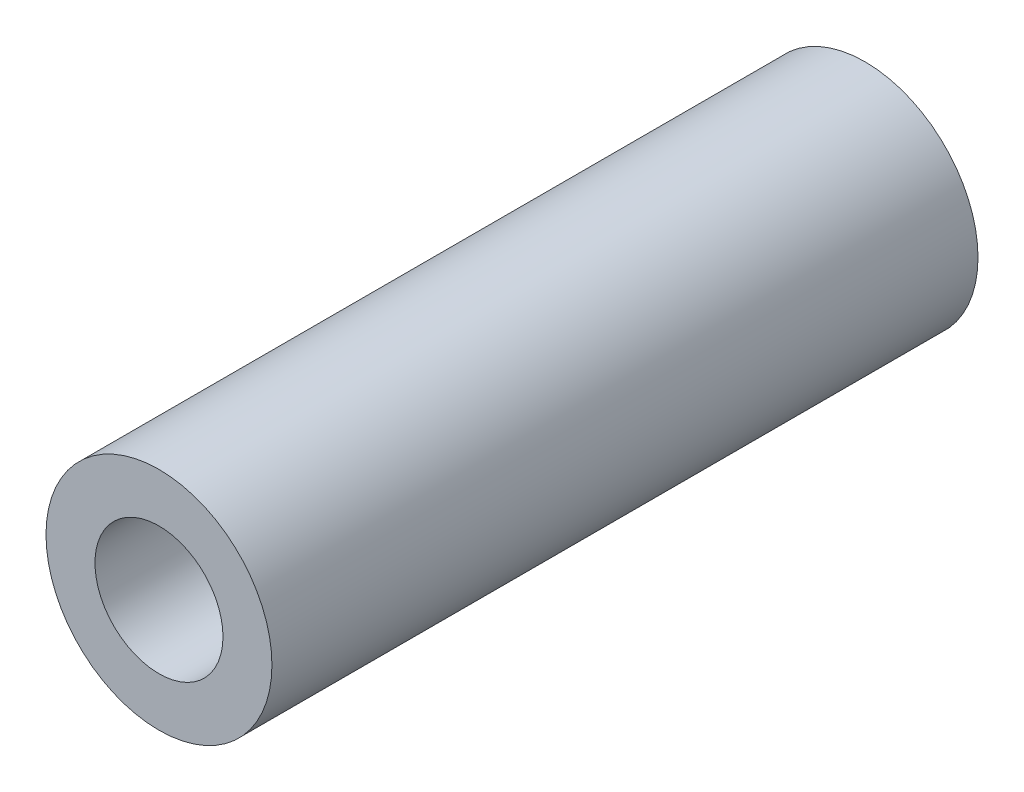
ISO-10303-21;
HEADER;
FILE_DESCRIPTION(('STEP AP214'),'2;1');
FILE_NAME('part.step','',(''),(''),'','','');
FILE_SCHEMA(('AUTOMOTIVE_DESIGN { 1 0 10303 214 1 1 1 1 }'));
ENDSEC;
DATA;
#1=APPLICATION_CONTEXT('core data for automotive mechanical design processes');
#2=APPLICATION_PROTOCOL_DEFINITION('international standard','automotive_design',2000,#1);
#3=PRODUCT_CONTEXT('',#1,'mechanical');
#4=PRODUCT('Part','Part','',(#3));
#5=PRODUCT_RELATED_PRODUCT_CATEGORY('part','',(#4));
#6=PRODUCT_DEFINITION_FORMATION('','',#4);
#7=PRODUCT_DEFINITION_CONTEXT('part definition',#1,'design');
#8=PRODUCT_DEFINITION('design','',#6,#7);
#9=PRODUCT_DEFINITION_SHAPE('','',#8);
#10=(LENGTH_UNIT() NAMED_UNIT(*) SI_UNIT(.MILLI.,.METRE.));
#11=(NAMED_UNIT(*) PLANE_ANGLE_UNIT() SI_UNIT($,.RADIAN.));
#12=(NAMED_UNIT(*) SI_UNIT($,.STERADIAN.) SOLID_ANGLE_UNIT());
#13=UNCERTAINTY_MEASURE_WITH_UNIT(LENGTH_MEASURE(1.E-05),#10,'distance_accuracy_value','');
#14=(GEOMETRIC_REPRESENTATION_CONTEXT(3) GLOBAL_UNCERTAINTY_ASSIGNED_CONTEXT((#13)) GLOBAL_UNIT_ASSIGNED_CONTEXT((#10,
#11,#12)) REPRESENTATION_CONTEXT('',''));
#15=CARTESIAN_POINT('',(0.,0.,0.));
#16=DIRECTION('',(0.,0.,1.));
#17=DIRECTION('',(1.,0.,0.));
#18=AXIS2_PLACEMENT_3D('',#15,#16,#17);
#19=CARTESIAN_POINT('',(1.95949363399761,6.334775703994E-06,-54.4705627484754));
#20=DIRECTION('',(0.,0.,1.));
#21=DIRECTION('',(1.,0.,0.));
#22=AXIS2_PLACEMENT_3D('',#19,#20,#21);
#23=CYLINDRICAL_SURFACE('',#22,5.9999999999994);
#24=CARTESIAN_POINT('',(1.95949363399761,6.334775703994E-06,0.));
#25=DIRECTION('',(0.,0.,1.));
#26=DIRECTION('',(1.,0.,0.));
#27=AXIS2_PLACEMENT_3D('',#24,#25,#26);
#28=CIRCLE('',#27,5.9999999999994);
#29=CARTESIAN_POINT('',(7.95949363399701,6.334775703994E-06,0.));
#30=VERTEX_POINT('',#29);
#31=EDGE_CURVE('E39',#30,#30,#28,.T.);
#32=CARTESIAN_POINT('',(1.95949363399761,6.334775703994E-06,-37.5));
#33=DIRECTION('',(0.,0.,-1.));
#34=DIRECTION('',(0.,1.,0.));
#35=AXIS2_PLACEMENT_3D('',#32,#33,#34);
#36=CIRCLE('',#35,5.9999999999994);
#37=CARTESIAN_POINT('',(7.95949363399701,6.334775703994E-06,-37.5));
#38=VERTEX_POINT('',#37);
#39=EDGE_CURVE('E48',#38,#38,#36,.F.);
#40=CARTESIAN_POINT('',(7.95949363399701,6.334775703994E-06,0.));
#41=CARTESIAN_POINT('',(7.95949363399701,6.334775703994E-06,-0.390625000000008));
#42=CARTESIAN_POINT('',(7.95949363399701,6.334775703994E-06,-0.781250000000009));
#43=CARTESIAN_POINT('',(7.95949363399701,6.334775703994E-06,-1.56250000000001));
#44=CARTESIAN_POINT('',(7.95949363399701,6.334775703994E-06,-1.95312500000001));
#45=CARTESIAN_POINT('',(7.95949363399701,6.334775703994E-06,-2.73437500000001));
#46=CARTESIAN_POINT('',(7.95949363399701,6.334775703994E-06,-3.12500000000001));
#47=CARTESIAN_POINT('',(7.95949363399701,6.334775703994E-06,-3.90625000000001));
#48=CARTESIAN_POINT('',(7.95949363399701,6.334775703994E-06,-4.29687500000001));
#49=CARTESIAN_POINT('',(7.95949363399701,6.334775703994E-06,-5.07812500000001));
#50=CARTESIAN_POINT('',(7.95949363399701,6.334775703994E-06,-5.46875000000001));
#51=CARTESIAN_POINT('',(7.95949363399701,6.334775703994E-06,-6.25000000000001));
#52=CARTESIAN_POINT('',(7.95949363399701,6.334775703994E-06,-6.640625));
#53=CARTESIAN_POINT('',(7.95949363399701,6.334775703994E-06,-7.421875));
#54=CARTESIAN_POINT('',(7.95949363399701,6.334775703994E-06,-7.81250000000001));
#55=CARTESIAN_POINT('',(7.95949363399701,6.334775703994E-06,-8.59375));
#56=CARTESIAN_POINT('',(7.95949363399701,6.334775703994E-06,-8.984375));
#57=CARTESIAN_POINT('',(7.95949363399701,6.334775703994E-06,-9.765625));
#58=CARTESIAN_POINT('',(7.95949363399701,6.334775703994E-06,-10.15625));
#59=CARTESIAN_POINT('',(7.95949363399701,6.334775703994E-06,-10.9375));
#60=CARTESIAN_POINT('',(7.95949363399701,6.334775703994E-06,-11.328125));
#61=CARTESIAN_POINT('',(7.95949363399701,6.334775703994E-06,-12.109375));
#62=CARTESIAN_POINT('',(7.95949363399701,6.334775703994E-06,-12.5));
#63=CARTESIAN_POINT('',(7.95949363399701,6.334775703994E-06,-13.28125));
#64=CARTESIAN_POINT('',(7.95949363399701,6.334775703994E-06,-13.671875));
#65=CARTESIAN_POINT('',(7.95949363399701,6.334775703994E-06,-14.453125));
#66=CARTESIAN_POINT('',(7.95949363399701,6.334775703994E-06,-14.84375));
#67=CARTESIAN_POINT('',(7.95949363399701,6.334775703994E-06,-15.625));
#68=CARTESIAN_POINT('',(7.95949363399701,6.334775703994E-06,-16.015625));
#69=CARTESIAN_POINT('',(7.95949363399701,6.334775703994E-06,-16.796875));
#70=CARTESIAN_POINT('',(7.95949363399701,6.334775703994E-06,-17.1875));
#71=CARTESIAN_POINT('',(7.95949363399701,6.334775703994E-06,-17.96875));
#72=CARTESIAN_POINT('',(7.95949363399701,6.334775703994E-06,-18.359375));
#73=CARTESIAN_POINT('',(7.95949363399701,6.334775703994E-06,-19.140625));
#74=CARTESIAN_POINT('',(7.95949363399701,6.334775703994E-06,-19.53125));
#75=CARTESIAN_POINT('',(7.95949363399701,6.334775703994E-06,-20.3125));
#76=CARTESIAN_POINT('',(7.95949363399701,6.334775703994E-06,-20.703125));
#77=CARTESIAN_POINT('',(7.95949363399701,6.334775703994E-06,-21.484375));
#78=CARTESIAN_POINT('',(7.95949363399701,6.334775703994E-06,-21.875));
#79=CARTESIAN_POINT('',(7.95949363399701,6.334775703994E-06,-22.65625));
#80=CARTESIAN_POINT('',(7.95949363399701,6.334775703994E-06,-23.046875));
#81=CARTESIAN_POINT('',(7.95949363399701,6.334775703994E-06,-23.828125));
#82=CARTESIAN_POINT('',(7.95949363399701,6.334775703994E-06,-24.21875));
#83=CARTESIAN_POINT('',(7.95949363399701,6.334775703994E-06,-25.));
#84=CARTESIAN_POINT('',(7.95949363399701,6.334775703994E-06,-25.390625));
#85=CARTESIAN_POINT('',(7.95949363399701,6.334775703994E-06,-26.171875));
#86=CARTESIAN_POINT('',(7.95949363399701,6.334775703994E-06,-26.5625));
#87=CARTESIAN_POINT('',(7.95949363399701,6.334775703994E-06,-27.34375));
#88=CARTESIAN_POINT('',(7.95949363399701,6.334775703994E-06,-27.734375));
#89=CARTESIAN_POINT('',(7.95949363399701,6.334775703994E-06,-28.515625));
#90=CARTESIAN_POINT('',(7.95949363399701,6.334775703994E-06,-28.90625));
#91=CARTESIAN_POINT('',(7.95949363399701,6.334775703994E-06,-29.6875));
#92=CARTESIAN_POINT('',(7.95949363399701,6.334775703994E-06,-30.078125));
#93=CARTESIAN_POINT('',(7.95949363399701,6.334775703994E-06,-30.859375));
#94=CARTESIAN_POINT('',(7.95949363399701,6.334775703994E-06,-31.25));
#95=CARTESIAN_POINT('',(7.95949363399701,6.334775703994E-06,-32.03125));
#96=CARTESIAN_POINT('',(7.95949363399701,6.334775703994E-06,-32.421875));
#97=CARTESIAN_POINT('',(7.95949363399701,6.334775703994E-06,-33.203125));
#98=CARTESIAN_POINT('',(7.95949363399701,6.334775703994E-06,-33.59375));
#99=CARTESIAN_POINT('',(7.95949363399701,6.334775703994E-06,-34.375));
#100=CARTESIAN_POINT('',(7.95949363399701,6.334775703994E-06,-34.765625));
#101=CARTESIAN_POINT('',(7.95949363399701,6.334775703994E-06,-35.546875));
#102=CARTESIAN_POINT('',(7.95949363399701,6.334775703994E-06,-35.9375));
#103=CARTESIAN_POINT('',(7.95949363399701,6.334775703994E-06,-36.71875));
#104=CARTESIAN_POINT('',(7.95949363399701,6.334775703994E-06,-37.109375));
#105=CARTESIAN_POINT('',(7.95949363399701,6.334775703994E-06,-37.5));
#106=B_SPLINE_CURVE_WITH_KNOTS('',3,(#40,#41,#42,#43,#44,#45,#46,#47,#48,#49,#50,#51,#52,#53,
#54,#55,#56,#57,#58,#59,#60,#61,#62,#63,#64,#65,#66,#67,#68,#69,#70,#71,#72,#73,#74,#75,#76,#77,
#78,#79,#80,#81,#82,#83,#84,#85,#86,#87,#88,#89,#90,#91,#92,#93,#94,#95,#96,#97,#98,#99,#100,
#101,#102,#103,#104,#105),.UNSPECIFIED.,.F.,.F.,(4,2,2,2,2,2,2,2,2,2,2,2,2,2,2,2,2,2,2,2,2,2,2,
2,2,2,2,2,2,2,2,2,4),(0.,1.171875,2.34375,3.515625,4.6875,5.859375,7.03125,8.203125,
9.37499999999999,10.546875,11.71875,12.890625,14.0625,15.234375,16.40625,17.578125,18.75,
19.921875,21.09375,22.265625,23.4375,24.609375,25.78125,26.953125,28.125,29.296875,30.46875,
31.640625,32.8125,33.984375,35.15625,36.328125,37.5),.UNSPECIFIED.);
#107=EDGE_CURVE('BSEAM32',#30,#38,#106,.T.);
#108=ORIENTED_EDGE('',*,*,#31,.F.);
#109=ORIENTED_EDGE('',*,*,#39,.T.);
#110=ORIENTED_EDGE('',*,*,#107,.T.);
#111=ORIENTED_EDGE('',*,*,#107,.F.);
#112=EDGE_LOOP('',(#108,#110,#109,#111));
#113=FACE_BOUND('',#112,.T.);
#114=ADVANCED_FACE('F32',(#113),#23,.T.);
#115=CARTESIAN_POINT('',(1.95949363399761,6.334775703994E-06,-54.4705627484754));
#116=DIRECTION('',(0.,0.,1.));
#117=DIRECTION('',(1.,0.,0.));
#118=AXIS2_PLACEMENT_3D('',#115,#116,#117);
#119=CYLINDRICAL_SURFACE('',#118,3.4);
#120=CARTESIAN_POINT('',(1.95949363399761,6.334775703994E-06,0.));
#121=DIRECTION('',(0.,0.,1.));
#122=DIRECTION('',(1.,0.,0.));
#123=AXIS2_PLACEMENT_3D('',#120,#121,#122);
#124=CIRCLE('',#123,3.4);
#125=CARTESIAN_POINT('',(5.35949363399761,6.334775703994E-06,0.));
#126=VERTEX_POINT('',#125);
#127=EDGE_CURVE('E43',#126,#126,#124,.T.);
#128=CARTESIAN_POINT('',(1.95949363399761,6.334775703994E-06,-37.5));
#129=DIRECTION('',(0.,0.,-1.));
#130=DIRECTION('',(0.,1.,0.));
#131=AXIS2_PLACEMENT_3D('',#128,#129,#130);
#132=CIRCLE('',#131,3.4);
#133=CARTESIAN_POINT('',(5.35949363399761,6.334775703994E-06,-37.5));
#134=VERTEX_POINT('',#133);
#135=EDGE_CURVE('E10',#134,#134,#132,.F.);
#136=CARTESIAN_POINT('',(5.35949363399761,6.334775703994E-06,0.));
#137=CARTESIAN_POINT('',(5.35949363399761,6.334775703994E-06,-0.390625000000008));
#138=CARTESIAN_POINT('',(5.35949363399761,6.334775703994E-06,-0.781250000000009));
#139=CARTESIAN_POINT('',(5.35949363399761,6.334775703994E-06,-1.56250000000001));
#140=CARTESIAN_POINT('',(5.35949363399761,6.334775703994E-06,-1.95312500000001));
#141=CARTESIAN_POINT('',(5.35949363399761,6.334775703994E-06,-2.73437500000001));
#142=CARTESIAN_POINT('',(5.35949363399761,6.334775703994E-06,-3.12500000000001));
#143=CARTESIAN_POINT('',(5.35949363399761,6.334775703994E-06,-3.90625000000001));
#144=CARTESIAN_POINT('',(5.35949363399761,6.334775703994E-06,-4.29687500000001));
#145=CARTESIAN_POINT('',(5.35949363399761,6.334775703994E-06,-5.07812500000001));
#146=CARTESIAN_POINT('',(5.35949363399761,6.334775703994E-06,-5.46875000000001));
#147=CARTESIAN_POINT('',(5.35949363399761,6.334775703994E-06,-6.25000000000001));
#148=CARTESIAN_POINT('',(5.35949363399761,6.334775703994E-06,-6.640625));
#149=CARTESIAN_POINT('',(5.35949363399761,6.334775703994E-06,-7.421875));
#150=CARTESIAN_POINT('',(5.35949363399761,6.334775703994E-06,-7.81250000000001));
#151=CARTESIAN_POINT('',(5.35949363399761,6.334775703994E-06,-8.59375));
#152=CARTESIAN_POINT('',(5.35949363399761,6.334775703994E-06,-8.984375));
#153=CARTESIAN_POINT('',(5.35949363399761,6.334775703994E-06,-9.765625));
#154=CARTESIAN_POINT('',(5.35949363399761,6.334775703994E-06,-10.15625));
#155=CARTESIAN_POINT('',(5.35949363399761,6.334775703994E-06,-10.9375));
#156=CARTESIAN_POINT('',(5.35949363399761,6.334775703994E-06,-11.328125));
#157=CARTESIAN_POINT('',(5.35949363399761,6.334775703994E-06,-12.109375));
#158=CARTESIAN_POINT('',(5.35949363399761,6.334775703994E-06,-12.5));
#159=CARTESIAN_POINT('',(5.35949363399761,6.334775703994E-06,-13.28125));
#160=CARTESIAN_POINT('',(5.35949363399761,6.334775703994E-06,-13.671875));
#161=CARTESIAN_POINT('',(5.35949363399761,6.334775703994E-06,-14.453125));
#162=CARTESIAN_POINT('',(5.35949363399761,6.334775703994E-06,-14.84375));
#163=CARTESIAN_POINT('',(5.35949363399761,6.334775703994E-06,-15.625));
#164=CARTESIAN_POINT('',(5.35949363399761,6.334775703994E-06,-16.015625));
#165=CARTESIAN_POINT('',(5.35949363399761,6.334775703994E-06,-16.796875));
#166=CARTESIAN_POINT('',(5.35949363399761,6.334775703994E-06,-17.1875));
#167=CARTESIAN_POINT('',(5.35949363399761,6.334775703994E-06,-17.96875));
#168=CARTESIAN_POINT('',(5.35949363399761,6.334775703994E-06,-18.359375));
#169=CARTESIAN_POINT('',(5.35949363399761,6.334775703994E-06,-19.140625));
#170=CARTESIAN_POINT('',(5.35949363399761,6.334775703994E-06,-19.53125));
#171=CARTESIAN_POINT('',(5.35949363399761,6.334775703994E-06,-20.3125));
#172=CARTESIAN_POINT('',(5.35949363399761,6.334775703994E-06,-20.703125));
#173=CARTESIAN_POINT('',(5.35949363399761,6.334775703994E-06,-21.484375));
#174=CARTESIAN_POINT('',(5.35949363399761,6.334775703994E-06,-21.875));
#175=CARTESIAN_POINT('',(5.35949363399761,6.334775703994E-06,-22.65625));
#176=CARTESIAN_POINT('',(5.35949363399761,6.334775703994E-06,-23.046875));
#177=CARTESIAN_POINT('',(5.35949363399761,6.334775703994E-06,-23.828125));
#178=CARTESIAN_POINT('',(5.35949363399761,6.334775703994E-06,-24.21875));
#179=CARTESIAN_POINT('',(5.35949363399761,6.334775703994E-06,-25.));
#180=CARTESIAN_POINT('',(5.35949363399761,6.334775703994E-06,-25.390625));
#181=CARTESIAN_POINT('',(5.35949363399761,6.334775703994E-06,-26.171875));
#182=CARTESIAN_POINT('',(5.35949363399761,6.334775703994E-06,-26.5625));
#183=CARTESIAN_POINT('',(5.35949363399761,6.334775703994E-06,-27.34375));
#184=CARTESIAN_POINT('',(5.35949363399761,6.334775703994E-06,-27.734375));
#185=CARTESIAN_POINT('',(5.35949363399761,6.334775703994E-06,-28.515625));
#186=CARTESIAN_POINT('',(5.35949363399761,6.334775703994E-06,-28.90625));
#187=CARTESIAN_POINT('',(5.35949363399761,6.334775703994E-06,-29.6875));
#188=CARTESIAN_POINT('',(5.35949363399761,6.334775703994E-06,-30.078125));
#189=CARTESIAN_POINT('',(5.35949363399761,6.334775703994E-06,-30.859375));
#190=CARTESIAN_POINT('',(5.35949363399761,6.334775703994E-06,-31.25));
#191=CARTESIAN_POINT('',(5.35949363399761,6.334775703994E-06,-32.03125));
#192=CARTESIAN_POINT('',(5.35949363399761,6.334775703994E-06,-32.421875));
#193=CARTESIAN_POINT('',(5.35949363399761,6.334775703994E-06,-33.203125));
#194=CARTESIAN_POINT('',(5.35949363399761,6.334775703994E-06,-33.59375));
#195=CARTESIAN_POINT('',(5.35949363399761,6.334775703994E-06,-34.375));
#196=CARTESIAN_POINT('',(5.35949363399761,6.334775703994E-06,-34.765625));
#197=CARTESIAN_POINT('',(5.35949363399761,6.334775703994E-06,-35.546875));
#198=CARTESIAN_POINT('',(5.35949363399761,6.334775703994E-06,-35.9375));
#199=CARTESIAN_POINT('',(5.35949363399761,6.334775703994E-06,-36.71875));
#200=CARTESIAN_POINT('',(5.35949363399761,6.334775703994E-06,-37.109375));
#201=CARTESIAN_POINT('',(5.35949363399761,6.334775703994E-06,-37.5));
#202=B_SPLINE_CURVE_WITH_KNOTS('',3,(#136,#137,#138,#139,#140,#141,#142,#143,#144,#145,#146,
#147,#148,#149,#150,#151,#152,#153,#154,#155,#156,#157,#158,#159,#160,#161,#162,#163,#164,#165,
#166,#167,#168,#169,#170,#171,#172,#173,#174,#175,#176,#177,#178,#179,#180,#181,#182,#183,#184,
#185,#186,#187,#188,#189,#190,#191,#192,#193,#194,#195,#196,#197,#198,#199,#200,#201),
.UNSPECIFIED.,.F.,.F.,(4,2,2,2,2,2,2,2,2,2,2,2,2,2,2,2,2,2,2,2,2,2,2,2,2,2,2,2,2,2,2,2,4),(0.,
1.171875,2.34375,3.515625,4.6875,5.859375,7.03125,8.203125,9.37499999999999,10.546875,11.71875,
12.890625,14.0625,15.234375,16.40625,17.578125,18.75,19.921875,21.09375,22.265625,23.4375,
24.609375,25.78125,26.953125,28.125,29.296875,30.46875,31.640625,32.8125,33.984375,35.15625,
36.328125,37.5),.UNSPECIFIED.);
#203=EDGE_CURVE('BSEAM59',#126,#134,#202,.T.);
#204=ORIENTED_EDGE('',*,*,#127,.T.);
#205=ORIENTED_EDGE('',*,*,#135,.F.);
#206=ORIENTED_EDGE('',*,*,#203,.T.);
#207=ORIENTED_EDGE('',*,*,#203,.F.);
#208=EDGE_LOOP('',(#204,#206,#205,#207));
#209=FACE_BOUND('',#208,.T.);
#210=ADVANCED_FACE('F59',(#209),#119,.F.);
#211=CARTESIAN_POINT('',(1.95949363399761,6.334775703994E-06,0.));
#212=DIRECTION('',(0.,0.,1.));
#213=DIRECTION('',(1.,0.,0.));
#214=AXIS2_PLACEMENT_3D('',#211,#212,#213);
#215=PLANE('',#214);
#216=ORIENTED_EDGE('',*,*,#127,.F.);
#217=EDGE_LOOP('',(#216));
#218=FACE_BOUND('',#217,.T.);
#219=ORIENTED_EDGE('',*,*,#31,.T.);
#220=EDGE_LOOP('',(#219));
#221=FACE_BOUND('',#220,.T.);
#222=ADVANCED_FACE('F55',(#218,#221),#215,.T.);
#223=CARTESIAN_POINT('',(-11.9094560444591,14.4101498044444,-37.5));
#224=DIRECTION('',(0.,0.,-1.));
#225=DIRECTION('',(-0.693447483922834,0.720507173483437,0.));
#226=AXIS2_PLACEMENT_3D('',#223,#224,#225);
#227=PLANE('',#226);
#228=ORIENTED_EDGE('',*,*,#39,.F.);
#229=EDGE_LOOP('',(#228));
#230=FACE_BOUND('',#229,.T.);
#231=ORIENTED_EDGE('',*,*,#135,.T.);
#232=EDGE_LOOP('',(#231));
#233=FACE_BOUND('',#232,.T.);
#234=ADVANCED_FACE('F34',(#230,#233),#227,.T.);
#235=CLOSED_SHELL('',(#114,#210,#222,#234));
#236=MANIFOLD_SOLID_BREP('B2',#235);
#237=ADVANCED_BREP_SHAPE_REPRESENTATION('',(#18,#236),#14);
#238=SHAPE_DEFINITION_REPRESENTATION(#9,#237);
ENDSEC;
END-ISO-10303-21;
